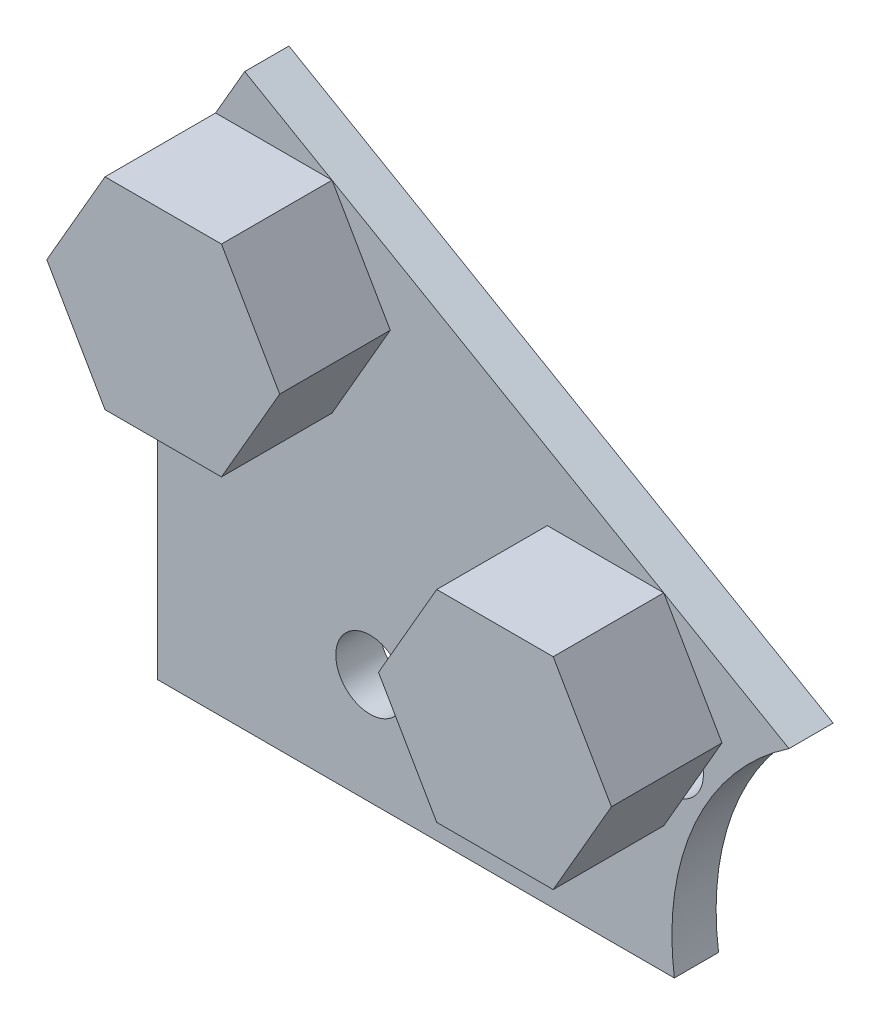
ISO-10303-21;
HEADER;
FILE_DESCRIPTION(('STEP AP214'),'2;1');
FILE_NAME('part.step','',(''),(''),'','','');
FILE_SCHEMA(('AUTOMOTIVE_DESIGN { 1 0 10303 214 1 1 1 1 }'));
ENDSEC;
DATA;
#1=APPLICATION_CONTEXT('core data for automotive mechanical design processes');
#2=APPLICATION_PROTOCOL_DEFINITION('international standard','automotive_design',2000,#1);
#3=PRODUCT_CONTEXT('',#1,'mechanical');
#4=PRODUCT('Part','Part','',(#3));
#5=PRODUCT_RELATED_PRODUCT_CATEGORY('part','',(#4));
#6=PRODUCT_DEFINITION_FORMATION('','',#4);
#7=PRODUCT_DEFINITION_CONTEXT('part definition',#1,'design');
#8=PRODUCT_DEFINITION('design','',#6,#7);
#9=PRODUCT_DEFINITION_SHAPE('','',#8);
#10=(LENGTH_UNIT() NAMED_UNIT(*) SI_UNIT(.MILLI.,.METRE.));
#11=(NAMED_UNIT(*) PLANE_ANGLE_UNIT() SI_UNIT($,.RADIAN.));
#12=(NAMED_UNIT(*) SI_UNIT($,.STERADIAN.) SOLID_ANGLE_UNIT());
#13=UNCERTAINTY_MEASURE_WITH_UNIT(LENGTH_MEASURE(1.E-05),#10,'distance_accuracy_value','');
#14=(GEOMETRIC_REPRESENTATION_CONTEXT(3) GLOBAL_UNCERTAINTY_ASSIGNED_CONTEXT((#13)) GLOBAL_UNIT_ASSIGNED_CONTEXT((#10,
#11,#12)) REPRESENTATION_CONTEXT('',''));
#15=CARTESIAN_POINT('',(0.,0.,0.));
#16=DIRECTION('',(0.,0.,1.));
#17=DIRECTION('',(1.,0.,0.));
#18=AXIS2_PLACEMENT_3D('',#15,#16,#17);
#19=CARTESIAN_POINT('',(0.,0.,0.));
#20=DIRECTION('',(0.,0.,-1.));
#21=DIRECTION('',(-1.,0.,0.));
#22=AXIS2_PLACEMENT_3D('',#19,#20,#21);
#23=PLANE('',#22);
#24=DIRECTION('',(-1.,0.,0.));
#25=VECTOR('',#24,1.);
#26=CARTESIAN_POINT('',(-27.3671361036775,21.8807621135332,0.));
#27=LINE('',#26,#25);
#28=CARTESIAN_POINT('',(-27.3671361036775,21.8807621135332,0.));
#29=VERTEX_POINT('',#28);
#30=CARTESIAN_POINT('',(-32.6328638963225,21.8807621135332,0.));
#31=VERTEX_POINT('',#30);
#32=EDGE_CURVE('E308',#29,#31,#27,.T.);
#33=ORIENTED_EDGE('',*,*,#32,.F.);
#34=DIRECTION('',(-0.866025403784439,0.5,0.));
#35=VECTOR('',#34,1.);
#36=CARTESIAN_POINT('',(-31.3164319481613,24.1608891324554,0.));
#37=LINE('',#36,#35);
#38=CARTESIAN_POINT('',(-31.3164319481613,24.1608891324554,0.));
#39=VERTEX_POINT('',#38);
#40=EDGE_CURVE('E197',#29,#39,#37,.T.);
#41=ORIENTED_EDGE('',*,*,#40,.T.);
#42=DIRECTION('',(-0.5,-0.866025403784439,0.));
#43=VECTOR('',#42,1.);
#44=CARTESIAN_POINT('',(-31.3164319481613,24.1608891324554,0.));
#45=LINE('',#44,#43);
#46=EDGE_CURVE('E195',#39,#31,#45,.T.);
#47=ORIENTED_EDGE('',*,*,#46,.T.);
#48=EDGE_LOOP('',(#33,#41,#47));
#49=FACE_BOUND('',#48,.T.);
#50=ADVANCED_FACE('F33',(#49),#23,.F.);
#51=CARTESIAN_POINT('',(-25.6473172210291,3.37653336856471,0.));
#52=DIRECTION('',(0.,0.,1.));
#53=DIRECTION('',(1.,0.,0.));
#54=AXIS2_PLACEMENT_3D('',#51,#52,#53);
#55=CIRCLE('',#54,1.55);
#56=CARTESIAN_POINT('',(-24.0973172210291,3.37653336856471,0.));
#57=VERTEX_POINT('',#56);
#58=EDGE_CURVE('E271',#57,#57,#55,.T.);
#59=ORIENTED_EDGE('',*,*,#58,.F.);
#60=EDGE_LOOP('',(#59));
#61=FACE_BOUND('',#60,.T.);
#62=DIRECTION('',(1.,0.,0.));
#63=VECTOR('',#62,1.);
#64=CARTESIAN_POINT('',(-10.9373088966795,-1.62346663143529,0.));
#65=LINE('',#64,#63);
#66=CARTESIAN_POINT('',(-35.2657277926451,-1.62346663143529,0.));
#67=VERTEX_POINT('',#66);
#68=CARTESIAN_POINT('',(-11.8896743477951,-1.62346663143529,0.));
#69=VERTEX_POINT('',#68);
#70=EDGE_CURVE('E178',#67,#69,#65,.T.);
#71=ORIENTED_EDGE('',*,*,#70,.T.);
#72=CARTESIAN_POINT('',(0.,0.,0.));
#73=DIRECTION('',(0.,0.,1.));
#74=DIRECTION('',(1.,0.,0.));
#75=AXIS2_PLACEMENT_3D('',#72,#73,#74);
#76=CIRCLE('',#75,12.);
#77=CARTESIAN_POINT('',(-6.70544875159861,9.95173135889855,0.));
#78=VERTEX_POINT('',#77);
#79=EDGE_CURVE('E161',#78,#69,#76,.T.);
#80=ORIENTED_EDGE('',*,*,#79,.F.);
#81=CARTESIAN_POINT('',(-12.3671361036775,13.2205080756888,0.));
#82=VERTEX_POINT('',#81);
#83=EDGE_CURVE('E170',#78,#82,#37,.T.);
#84=ORIENTED_EDGE('',*,*,#83,.T.);
#85=DIRECTION('',(-0.5,0.866025403784439,0.));
#86=VECTOR('',#85,1.);
#87=CARTESIAN_POINT('',(-9.73427220735493,8.66025403784439,0.));
#88=LINE('',#87,#86);
#89=CARTESIAN_POINT('',(-9.73427220735493,8.66025403784439,0.));
#90=VERTEX_POINT('',#89);
#91=EDGE_CURVE('E225',#90,#82,#88,.T.);
#92=ORIENTED_EDGE('',*,*,#91,.F.);
#93=DIRECTION('',(0.5,0.866025403784439,0.));
#94=VECTOR('',#93,1.);
#95=CARTESIAN_POINT('',(-12.3671361036775,4.1,0.));
#96=LINE('',#95,#94);
#97=CARTESIAN_POINT('',(-10.5855348451251,7.18582389864133,0.));
#98=VERTEX_POINT('',#97);
#99=EDGE_CURVE('E203',#98,#90,#96,.T.);
#100=ORIENTED_EDGE('',*,*,#99,.F.);
#101=CARTESIAN_POINT('',(-12.1243556529821,7.,0.));
#102=DIRECTION('',(0.,0.,1.));
#103=DIRECTION('',(1.,0.,0.));
#104=AXIS2_PLACEMENT_3D('',#101,#102,#103);
#105=CIRCLE('',#104,1.55);
#106=CARTESIAN_POINT('',(-11.5158734659073,5.57443013920306,0.));
#107=VERTEX_POINT('',#106);
#108=EDGE_CURVE('E265',#107,#98,#105,.T.);
#109=ORIENTED_EDGE('',*,*,#108,.F.);
#110=CARTESIAN_POINT('',(-12.3671361036775,4.1,0.));
#111=VERTEX_POINT('',#110);
#112=EDGE_CURVE('E223',#111,#107,#96,.T.);
#113=ORIENTED_EDGE('',*,*,#112,.F.);
#114=DIRECTION('',(1.,0.,0.));
#115=VECTOR('',#114,1.);
#116=CARTESIAN_POINT('',(-17.6328638963225,4.1,0.));
#117=LINE('',#116,#115);
#118=CARTESIAN_POINT('',(-17.6328638963225,4.1,0.));
#119=VERTEX_POINT('',#118);
#120=EDGE_CURVE('E212',#119,#111,#117,.T.);
#121=ORIENTED_EDGE('',*,*,#120,.F.);
#122=DIRECTION('',(0.5,-0.866025403784439,0.));
#123=VECTOR('',#122,1.);
#124=CARTESIAN_POINT('',(-20.2657277926451,8.66025403784439,0.));
#125=LINE('',#124,#123);
#126=CARTESIAN_POINT('',(-20.2657277926451,8.66025403784439,0.));
#127=VERTEX_POINT('',#126);
#128=EDGE_CURVE('E233',#127,#119,#125,.T.);
#129=ORIENTED_EDGE('',*,*,#128,.F.);
#130=DIRECTION('',(-0.5,-0.866025403784439,0.));
#131=VECTOR('',#130,1.);
#132=CARTESIAN_POINT('',(-17.6328638963225,13.2205080756888,0.));
#133=LINE('',#132,#131);
#134=CARTESIAN_POINT('',(-17.6328638963225,13.2205080756888,0.));
#135=VERTEX_POINT('',#134);
#136=EDGE_CURVE('E231',#135,#127,#133,.T.);
#137=ORIENTED_EDGE('',*,*,#136,.F.);
#138=DIRECTION('',(-1.,0.,0.));
#139=VECTOR('',#138,1.);
#140=CARTESIAN_POINT('',(-12.3671361036775,13.2205080756888,0.));
#141=LINE('',#140,#139);
#142=EDGE_CURVE('E229',#82,#135,#141,.T.);
#143=ORIENTED_EDGE('',*,*,#142,.F.);
#144=EDGE_CURVE('E196',#82,#29,#37,.T.);
#145=ORIENTED_EDGE('',*,*,#144,.T.);
#146=DIRECTION('',(-0.5,0.866025403784439,0.));
#147=VECTOR('',#146,1.);
#148=CARTESIAN_POINT('',(-24.7342722073549,17.3205080756888,0.));
#149=LINE('',#148,#147);
#150=CARTESIAN_POINT('',(-24.7342722073549,17.3205080756888,0.));
#151=VERTEX_POINT('',#150);
#152=EDGE_CURVE('E298',#151,#29,#149,.T.);
#153=ORIENTED_EDGE('',*,*,#152,.F.);
#154=DIRECTION('',(0.5,0.866025403784439,0.));
#155=VECTOR('',#154,1.);
#156=CARTESIAN_POINT('',(-27.3671361036775,12.7602540378444,0.));
#157=LINE('',#156,#155);
#158=CARTESIAN_POINT('',(-27.3671361036775,12.7602540378444,0.));
#159=VERTEX_POINT('',#158);
#160=EDGE_CURVE('E302',#159,#151,#157,.T.);
#161=ORIENTED_EDGE('',*,*,#160,.F.);
#162=DIRECTION('',(1.,0.,0.));
#163=VECTOR('',#162,1.);
#164=CARTESIAN_POINT('',(-32.6328638963225,12.7602540378444,0.));
#165=LINE('',#164,#163);
#166=CARTESIAN_POINT('',(-32.6328638963225,12.7602540378444,0.));
#167=VERTEX_POINT('',#166);
#168=EDGE_CURVE('E56',#167,#159,#165,.T.);
#169=ORIENTED_EDGE('',*,*,#168,.F.);
#170=DIRECTION('',(0.5,-0.866025403784439,0.));
#171=VECTOR('',#170,1.);
#172=CARTESIAN_POINT('',(-35.2657277926451,17.3205080756888,0.));
#173=LINE('',#172,#171);
#174=CARTESIAN_POINT('',(-35.2657277926451,17.3205080756888,0.));
#175=VERTEX_POINT('',#174);
#176=EDGE_CURVE('E306',#175,#167,#173,.T.);
#177=ORIENTED_EDGE('',*,*,#176,.F.);
#178=DIRECTION('',(0.,-1.,0.));
#179=VECTOR('',#178,1.);
#180=CARTESIAN_POINT('',(-35.2657277926451,17.3205080756888,0.));
#181=LINE('',#180,#179);
#182=EDGE_CURVE('E183',#175,#67,#181,.T.);
#183=ORIENTED_EDGE('',*,*,#182,.T.);
#184=EDGE_LOOP('',(#71,#80,#84,#92,#100,#109,#113,#121,#129,#137,#143,#145,#153,#161,#169,#177,#183));
#185=FACE_BOUND('',#184,.T.);
#186=ADVANCED_FACE('F255',(#61,#185),#23,.F.);
#187=CARTESIAN_POINT('',(0.,0.,0.));
#188=DIRECTION('',(0.,0.,1.));
#189=DIRECTION('',(1.,0.,0.));
#190=AXIS2_PLACEMENT_3D('',#187,#188,#189);
#191=PLANE('',#190);
#192=EDGE_CURVE('E186',#98,#107,#105,.T.);
#193=ORIENTED_EDGE('',*,*,#192,.F.);
#194=EDGE_CURVE('E226',#107,#98,#96,.T.);
#195=ORIENTED_EDGE('',*,*,#194,.F.);
#196=EDGE_LOOP('',(#193,#195));
#197=FACE_BOUND('',#196,.T.);
#198=ADVANCED_FACE('F368',(#197),#191,.F.);
#199=CARTESIAN_POINT('',(-12.3671361036775,4.1,5.));
#200=DIRECTION('',(-0.866025403784439,0.5,0.));
#201=DIRECTION('',(-0.5,-0.866025403784439,0.));
#202=AXIS2_PLACEMENT_3D('',#199,#200,#201);
#203=PLANE('',#202);
#204=ORIENTED_EDGE('',*,*,#112,.T.);
#205=ORIENTED_EDGE('',*,*,#194,.T.);
#206=ORIENTED_EDGE('',*,*,#99,.T.);
#207=DIRECTION('',(0.,0.,-1.));
#208=VECTOR('',#207,1.);
#209=CARTESIAN_POINT('',(-9.73427220735493,8.66025403784439,5.));
#210=LINE('',#209,#208);
#211=CARTESIAN_POINT('',(-9.73427220735493,8.66025403784439,5.));
#212=VERTEX_POINT('',#211);
#213=EDGE_CURVE('E11',#212,#90,#210,.T.);
#214=ORIENTED_EDGE('',*,*,#213,.F.);
#215=DIRECTION('',(0.5,0.866025403784439,0.));
#216=VECTOR('',#215,1.);
#217=CARTESIAN_POINT('',(-12.3671361036775,4.1,5.));
#218=LINE('',#217,#216);
#219=CARTESIAN_POINT('',(-12.3671361036775,4.1,5.));
#220=VERTEX_POINT('',#219);
#221=EDGE_CURVE('E208',#220,#212,#218,.T.);
#222=ORIENTED_EDGE('',*,*,#221,.F.);
#223=DIRECTION('',(0.,0.,-1.));
#224=VECTOR('',#223,1.);
#225=CARTESIAN_POINT('',(-12.3671361036775,4.1,5.));
#226=LINE('',#225,#224);
#227=EDGE_CURVE('E222',#220,#111,#226,.T.);
#228=ORIENTED_EDGE('',*,*,#227,.T.);
#229=EDGE_LOOP('',(#204,#205,#206,#214,#222,#228));
#230=FACE_BOUND('',#229,.T.);
#231=ADVANCED_FACE('F35',(#230),#203,.F.);
#232=CARTESIAN_POINT('',(-9.73427220735493,8.66025403784439,5.));
#233=DIRECTION('',(-0.866025403784439,-0.5,0.));
#234=DIRECTION('',(0.5,-0.866025403784439,0.));
#235=AXIS2_PLACEMENT_3D('',#232,#233,#234);
#236=PLANE('',#235);
#237=ORIENTED_EDGE('',*,*,#91,.T.);
#238=DIRECTION('',(0.,0.,-1.));
#239=VECTOR('',#238,1.);
#240=CARTESIAN_POINT('',(-12.3671361036775,13.2205080756888,5.));
#241=LINE('',#240,#239);
#242=CARTESIAN_POINT('',(-12.3671361036775,13.2205080756888,5.));
#243=VERTEX_POINT('',#242);
#244=EDGE_CURVE('E41',#243,#82,#241,.T.);
#245=ORIENTED_EDGE('',*,*,#244,.F.);
#246=DIRECTION('',(-0.5,0.866025403784439,0.));
#247=VECTOR('',#246,1.);
#248=CARTESIAN_POINT('',(-9.73427220735493,8.66025403784439,5.));
#249=LINE('',#248,#247);
#250=EDGE_CURVE('E211',#212,#243,#249,.T.);
#251=ORIENTED_EDGE('',*,*,#250,.F.);
#252=ORIENTED_EDGE('',*,*,#213,.T.);
#253=EDGE_LOOP('',(#237,#245,#251,#252));
#254=FACE_BOUND('',#253,.T.);
#255=ADVANCED_FACE('F401',(#254),#236,.F.);
#256=CARTESIAN_POINT('',(-12.3671361036775,13.2205080756888,5.));
#257=DIRECTION('',(0.,-1.,0.));
#258=DIRECTION('',(0.,0.,-1.));
#259=AXIS2_PLACEMENT_3D('',#256,#257,#258);
#260=PLANE('',#259);
#261=ORIENTED_EDGE('',*,*,#142,.T.);
#262=DIRECTION('',(0.,0.,-1.));
#263=VECTOR('',#262,1.);
#264=CARTESIAN_POINT('',(-17.6328638963225,13.2205080756888,5.));
#265=LINE('',#264,#263);
#266=CARTESIAN_POINT('',(-17.6328638963225,13.2205080756888,5.));
#267=VERTEX_POINT('',#266);
#268=EDGE_CURVE('E244',#267,#135,#265,.T.);
#269=ORIENTED_EDGE('',*,*,#268,.F.);
#270=DIRECTION('',(-1.,0.,0.));
#271=VECTOR('',#270,1.);
#272=CARTESIAN_POINT('',(-12.3671361036775,13.2205080756888,5.));
#273=LINE('',#272,#271);
#274=EDGE_CURVE('E214',#243,#267,#273,.T.);
#275=ORIENTED_EDGE('',*,*,#274,.F.);
#276=ORIENTED_EDGE('',*,*,#244,.T.);
#277=EDGE_LOOP('',(#261,#269,#275,#276));
#278=FACE_BOUND('',#277,.T.);
#279=ADVANCED_FACE('F251',(#278),#260,.F.);
#280=CARTESIAN_POINT('',(-17.6328638963225,13.2205080756888,5.));
#281=DIRECTION('',(0.866025403784439,-0.5,0.));
#282=DIRECTION('',(0.5,0.866025403784439,0.));
#283=AXIS2_PLACEMENT_3D('',#280,#281,#282);
#284=PLANE('',#283);
#285=ORIENTED_EDGE('',*,*,#136,.T.);
#286=DIRECTION('',(0.,0.,-1.));
#287=VECTOR('',#286,1.);
#288=CARTESIAN_POINT('',(-20.2657277926451,8.66025403784439,5.));
#289=LINE('',#288,#287);
#290=CARTESIAN_POINT('',(-20.2657277926451,8.66025403784439,5.));
#291=VERTEX_POINT('',#290);
#292=EDGE_CURVE('E241',#291,#127,#289,.T.);
#293=ORIENTED_EDGE('',*,*,#292,.F.);
#294=DIRECTION('',(-0.5,-0.866025403784439,0.));
#295=VECTOR('',#294,1.);
#296=CARTESIAN_POINT('',(-17.6328638963225,13.2205080756888,5.));
#297=LINE('',#296,#295);
#298=EDGE_CURVE('E216',#267,#291,#297,.T.);
#299=ORIENTED_EDGE('',*,*,#298,.F.);
#300=ORIENTED_EDGE('',*,*,#268,.T.);
#301=EDGE_LOOP('',(#285,#293,#299,#300));
#302=FACE_BOUND('',#301,.T.);
#303=ADVANCED_FACE('F395',(#302),#284,.F.);
#304=CARTESIAN_POINT('',(-20.2657277926451,8.66025403784439,5.));
#305=DIRECTION('',(0.866025403784439,0.5,0.));
#306=DIRECTION('',(-0.5,0.866025403784439,0.));
#307=AXIS2_PLACEMENT_3D('',#304,#305,#306);
#308=PLANE('',#307);
#309=ORIENTED_EDGE('',*,*,#128,.T.);
#310=DIRECTION('',(0.,0.,-1.));
#311=VECTOR('',#310,1.);
#312=CARTESIAN_POINT('',(-17.6328638963225,4.1,5.));
#313=LINE('',#312,#311);
#314=CARTESIAN_POINT('',(-17.6328638963225,4.1,5.));
#315=VERTEX_POINT('',#314);
#316=EDGE_CURVE('E238',#315,#119,#313,.T.);
#317=ORIENTED_EDGE('',*,*,#316,.F.);
#318=DIRECTION('',(0.5,-0.866025403784439,0.));
#319=VECTOR('',#318,1.);
#320=CARTESIAN_POINT('',(-20.2657277926451,8.66025403784439,5.));
#321=LINE('',#320,#319);
#322=EDGE_CURVE('E218',#291,#315,#321,.T.);
#323=ORIENTED_EDGE('',*,*,#322,.F.);
#324=ORIENTED_EDGE('',*,*,#292,.T.);
#325=EDGE_LOOP('',(#309,#317,#323,#324));
#326=FACE_BOUND('',#325,.T.);
#327=ADVANCED_FACE('F391',(#326),#308,.F.);
#328=CARTESIAN_POINT('',(-17.6328638963225,4.1,5.));
#329=DIRECTION('',(0.,1.,0.));
#330=DIRECTION('',(-1.,0.,0.));
#331=AXIS2_PLACEMENT_3D('',#328,#329,#330);
#332=PLANE('',#331);
#333=ORIENTED_EDGE('',*,*,#120,.T.);
#334=ORIENTED_EDGE('',*,*,#227,.F.);
#335=DIRECTION('',(1.,0.,0.));
#336=VECTOR('',#335,1.);
#337=CARTESIAN_POINT('',(-17.6328638963225,4.1,5.));
#338=LINE('',#337,#336);
#339=EDGE_CURVE('E220',#315,#220,#338,.T.);
#340=ORIENTED_EDGE('',*,*,#339,.F.);
#341=ORIENTED_EDGE('',*,*,#316,.T.);
#342=EDGE_LOOP('',(#333,#334,#340,#341));
#343=FACE_BOUND('',#342,.T.);
#344=ADVANCED_FACE('F384',(#343),#332,.F.);
#345=CARTESIAN_POINT('',(0.,0.,5.));
#346=DIRECTION('',(0.,0.,1.));
#347=DIRECTION('',(1.,0.,0.));
#348=AXIS2_PLACEMENT_3D('',#345,#346,#347);
#349=PLANE('',#348);
#350=ORIENTED_EDGE('',*,*,#221,.T.);
#351=ORIENTED_EDGE('',*,*,#250,.T.);
#352=ORIENTED_EDGE('',*,*,#274,.T.);
#353=ORIENTED_EDGE('',*,*,#298,.T.);
#354=ORIENTED_EDGE('',*,*,#322,.T.);
#355=ORIENTED_EDGE('',*,*,#339,.T.);
#356=EDGE_LOOP('',(#350,#351,#352,#353,#354,#355));
#357=FACE_BOUND('',#356,.T.);
#358=ADVANCED_FACE('F375',(#357),#349,.T.);
#359=CARTESIAN_POINT('',(-10.9373088966795,-1.62346663143529,-2.));
#360=DIRECTION('',(0.,-1.,0.));
#361=DIRECTION('',(1.,0.,0.));
#362=AXIS2_PLACEMENT_3D('',#359,#360,#361);
#363=PLANE('',#362);
#364=DIRECTION('',(0.,0.,1.));
#365=VECTOR('',#364,1.);
#366=CARTESIAN_POINT('',(-11.8896743477951,-1.62346663143529,-2.));
#367=LINE('',#366,#365);
#368=CARTESIAN_POINT('',(-11.8896743477951,-1.62346663143529,-2.));
#369=VERTEX_POINT('',#368);
#370=EDGE_CURVE('E48',#69,#369,#367,.F.);
#371=ORIENTED_EDGE('',*,*,#370,.F.);
#372=ORIENTED_EDGE('',*,*,#70,.F.);
#373=DIRECTION('',(0.,0.,1.));
#374=VECTOR('',#373,1.);
#375=CARTESIAN_POINT('',(-35.2657277926451,-1.62346663143529,-2.));
#376=LINE('',#375,#374);
#377=CARTESIAN_POINT('',(-35.2657277926451,-1.62346663143529,-2.));
#378=VERTEX_POINT('',#377);
#379=EDGE_CURVE('E201',#378,#67,#376,.T.);
#380=ORIENTED_EDGE('',*,*,#379,.F.);
#381=DIRECTION('',(1.,0.,0.));
#382=VECTOR('',#381,1.);
#383=CARTESIAN_POINT('',(-10.9373088966795,-1.62346663143529,-2.));
#384=LINE('',#383,#382);
#385=EDGE_CURVE('E191',#378,#369,#384,.T.);
#386=ORIENTED_EDGE('',*,*,#385,.T.);
#387=EDGE_LOOP('',(#371,#372,#380,#386));
#388=FACE_BOUND('',#387,.T.);
#389=ADVANCED_FACE('F325',(#388),#363,.T.);
#390=CARTESIAN_POINT('',(-35.2657277926451,17.3205080756888,-2.));
#391=DIRECTION('',(-1.,0.,0.));
#392=DIRECTION('',(0.,0.,1.));
#393=AXIS2_PLACEMENT_3D('',#390,#391,#392);
#394=PLANE('',#393);
#395=ORIENTED_EDGE('',*,*,#182,.F.);
#396=DIRECTION('',(0.,0.,1.));
#397=VECTOR('',#396,1.);
#398=CARTESIAN_POINT('',(-35.2657277926451,17.3205080756888,-2.));
#399=LINE('',#398,#397);
#400=CARTESIAN_POINT('',(-35.2657277926451,17.3205080756888,-2.));
#401=VERTEX_POINT('',#400);
#402=EDGE_CURVE('E204',#401,#175,#399,.T.);
#403=ORIENTED_EDGE('',*,*,#402,.F.);
#404=DIRECTION('',(0.,-1.,0.));
#405=VECTOR('',#404,1.);
#406=CARTESIAN_POINT('',(-35.2657277926451,17.3205080756888,-2.));
#407=LINE('',#406,#405);
#408=EDGE_CURVE('E180',#401,#378,#407,.T.);
#409=ORIENTED_EDGE('',*,*,#408,.T.);
#410=ORIENTED_EDGE('',*,*,#379,.T.);
#411=EDGE_LOOP('',(#395,#403,#409,#410));
#412=FACE_BOUND('',#411,.T.);
#413=ADVANCED_FACE('F328',(#412),#394,.T.);
#414=CARTESIAN_POINT('',(-31.3164319481613,24.1608891324554,-2.));
#415=DIRECTION('',(-0.866025403784439,0.5,0.));
#416=DIRECTION('',(-0.5,-0.866025403784439,0.));
#417=AXIS2_PLACEMENT_3D('',#414,#415,#416);
#418=PLANE('',#417);
#419=ORIENTED_EDGE('',*,*,#46,.F.);
#420=DIRECTION('',(0.,0.,1.));
#421=VECTOR('',#420,1.);
#422=CARTESIAN_POINT('',(-31.3164319481613,24.1608891324554,-2.));
#423=LINE('',#422,#421);
#424=CARTESIAN_POINT('',(-31.3164319481613,24.1608891324554,-2.));
#425=VERTEX_POINT('',#424);
#426=EDGE_CURVE('E193',#425,#39,#423,.T.);
#427=ORIENTED_EDGE('',*,*,#426,.F.);
#428=DIRECTION('',(-0.5,-0.866025403784439,0.));
#429=VECTOR('',#428,1.);
#430=CARTESIAN_POINT('',(-31.3164319481613,24.1608891324554,-2.));
#431=LINE('',#430,#429);
#432=EDGE_CURVE('E177',#425,#401,#431,.T.);
#433=ORIENTED_EDGE('',*,*,#432,.T.);
#434=ORIENTED_EDGE('',*,*,#402,.T.);
#435=DIRECTION('',(0.,0.,-1.));
#436=VECTOR('',#435,1.);
#437=CARTESIAN_POINT('',(-35.2657277926451,17.3205080756888,5.));
#438=LINE('',#437,#436);
#439=CARTESIAN_POINT('',(-35.2657277926451,17.3205080756888,5.));
#440=VERTEX_POINT('',#439);
#441=EDGE_CURVE('E282',#440,#175,#438,.T.);
#442=ORIENTED_EDGE('',*,*,#441,.F.);
#443=DIRECTION('',(-0.5,-0.866025403784438,0.));
#444=VECTOR('',#443,1.);
#445=CARTESIAN_POINT('',(-32.6328638963225,21.8807621135332,5.));
#446=LINE('',#445,#444);
#447=CARTESIAN_POINT('',(-32.6328638963225,21.8807621135332,5.));
#448=VERTEX_POINT('',#447);
#449=EDGE_CURVE('E318',#448,#440,#446,.T.);
#450=ORIENTED_EDGE('',*,*,#449,.F.);
#451=DIRECTION('',(0.,0.,-1.));
#452=VECTOR('',#451,1.);
#453=CARTESIAN_POINT('',(-32.6328638963225,21.8807621135332,5.));
#454=LINE('',#453,#452);
#455=EDGE_CURVE('E279',#448,#31,#454,.T.);
#456=ORIENTED_EDGE('',*,*,#455,.T.);
#457=EDGE_LOOP('',(#419,#427,#433,#434,#442,#450,#456));
#458=FACE_BOUND('',#457,.T.);
#459=ADVANCED_FACE('F336',(#458),#418,.T.);
#460=CARTESIAN_POINT('',(-31.3164319481613,24.1608891324554,-2.));
#461=DIRECTION('',(0.5,0.866025403784439,0.));
#462=DIRECTION('',(-0.866025403784439,0.5,0.));
#463=AXIS2_PLACEMENT_3D('',#460,#461,#462);
#464=PLANE('',#463);
#465=DIRECTION('',(0.,0.,1.));
#466=VECTOR('',#465,1.);
#467=CARTESIAN_POINT('',(-6.7054487515986,9.95173135889855,-2.));
#468=LINE('',#467,#466);
#469=CARTESIAN_POINT('',(-6.7054487515986,9.95173135889855,-2.));
#470=VERTEX_POINT('',#469);
#471=EDGE_CURVE('E155',#470,#78,#468,.T.);
#472=ORIENTED_EDGE('',*,*,#471,.F.);
#473=DIRECTION('',(-0.866025403784439,0.5,0.));
#474=VECTOR('',#473,1.);
#475=CARTESIAN_POINT('',(-12.3671361036775,13.2205080756888,-2.));
#476=LINE('',#475,#474);
#477=EDGE_CURVE('E167',#470,#425,#476,.T.);
#478=ORIENTED_EDGE('',*,*,#477,.T.);
#479=ORIENTED_EDGE('',*,*,#426,.T.);
#480=ORIENTED_EDGE('',*,*,#40,.F.);
#481=ORIENTED_EDGE('',*,*,#144,.F.);
#482=ORIENTED_EDGE('',*,*,#83,.F.);
#483=EDGE_LOOP('',(#472,#478,#479,#480,#481,#482));
#484=FACE_BOUND('',#483,.T.);
#485=ADVANCED_FACE('F165',(#484),#464,.T.);
#486=CARTESIAN_POINT('',(0.,0.,-2.));
#487=DIRECTION('',(0.,0.,-1.));
#488=DIRECTION('',(-1.,0.,0.));
#489=AXIS2_PLACEMENT_3D('',#486,#487,#488);
#490=PLANE('',#489);
#491=CARTESIAN_POINT('',(0.,0.,-2.));
#492=DIRECTION('',(0.,0.,1.));
#493=DIRECTION('',(1.,0.,0.));
#494=AXIS2_PLACEMENT_3D('',#491,#492,#493);
#495=CIRCLE('',#494,12.);
#496=EDGE_CURVE('E152',#470,#369,#495,.T.);
#497=ORIENTED_EDGE('',*,*,#496,.T.);
#498=ORIENTED_EDGE('',*,*,#385,.F.);
#499=ORIENTED_EDGE('',*,*,#408,.F.);
#500=ORIENTED_EDGE('',*,*,#432,.F.);
#501=ORIENTED_EDGE('',*,*,#477,.F.);
#502=EDGE_LOOP('',(#497,#498,#499,#500,#501));
#503=FACE_BOUND('',#502,.T.);
#504=CARTESIAN_POINT('',(-25.6473172210291,3.37653336856471,-2.));
#505=DIRECTION('',(0.,0.,1.));
#506=DIRECTION('',(1.,0.,0.));
#507=AXIS2_PLACEMENT_3D('',#504,#505,#506);
#508=CIRCLE('',#507,1.55);
#509=CARTESIAN_POINT('',(-24.0973172210291,3.37653336856471,-2.));
#510=VERTEX_POINT('',#509);
#511=EDGE_CURVE('E270',#510,#510,#508,.T.);
#512=ORIENTED_EDGE('',*,*,#511,.T.);
#513=EDGE_LOOP('',(#512));
#514=FACE_BOUND('',#513,.T.);
#515=CARTESIAN_POINT('',(-29.2707838524644,16.8994949366117,-2.));
#516=DIRECTION('',(0.,0.,1.));
#517=DIRECTION('',(1.,0.,0.));
#518=AXIS2_PLACEMENT_3D('',#515,#516,#517);
#519=CIRCLE('',#518,1.55);
#520=CARTESIAN_POINT('',(-27.7207838524644,16.8994949366117,-2.));
#521=VERTEX_POINT('',#520);
#522=EDGE_CURVE('E267',#521,#521,#519,.T.);
#523=ORIENTED_EDGE('',*,*,#522,.T.);
#524=EDGE_LOOP('',(#523));
#525=FACE_BOUND('',#524,.T.);
#526=CARTESIAN_POINT('',(-12.1243556529821,7.,-2.));
#527=DIRECTION('',(0.,0.,1.));
#528=DIRECTION('',(1.,0.,0.));
#529=AXIS2_PLACEMENT_3D('',#526,#527,#528);
#530=CIRCLE('',#529,1.55);
#531=CARTESIAN_POINT('',(-10.5743556529821,7.,-2.));
#532=VERTEX_POINT('',#531);
#533=EDGE_CURVE('E259',#532,#532,#530,.T.);
#534=ORIENTED_EDGE('',*,*,#533,.T.);
#535=EDGE_LOOP('',(#534));
#536=FACE_BOUND('',#535,.T.);
#537=ADVANCED_FACE('F173',(#503,#514,#525,#536),#490,.T.);
#538=CARTESIAN_POINT('',(-12.1243556529821,7.,-2.));
#539=DIRECTION('',(0.,0.,1.));
#540=DIRECTION('',(1.,0.,0.));
#541=AXIS2_PLACEMENT_3D('',#538,#539,#540);
#542=CYLINDRICAL_SURFACE('',#541,1.55);
#543=ORIENTED_EDGE('',*,*,#533,.F.);
#544=EDGE_LOOP('',(#543));
#545=FACE_BOUND('',#544,.T.);
#546=ORIENTED_EDGE('',*,*,#192,.T.);
#547=ORIENTED_EDGE('',*,*,#108,.T.);
#548=EDGE_LOOP('',(#546,#547));
#549=FACE_BOUND('',#548,.T.);
#550=ADVANCED_FACE('F415',(#545,#549),#542,.F.);
#551=CARTESIAN_POINT('',(-29.2707838524644,16.8994949366117,-2.));
#552=DIRECTION('',(0.,0.,1.));
#553=DIRECTION('',(1.,0.,0.));
#554=AXIS2_PLACEMENT_3D('',#551,#552,#553);
#555=CYLINDRICAL_SURFACE('',#554,1.55);
#556=ORIENTED_EDGE('',*,*,#522,.F.);
#557=EDGE_LOOP('',(#556));
#558=FACE_BOUND('',#557,.T.);
#559=CARTESIAN_POINT('',(-29.2707838524644,16.8994949366117,0.));
#560=DIRECTION('',(0.,0.,1.));
#561=DIRECTION('',(1.,0.,0.));
#562=AXIS2_PLACEMENT_3D('',#559,#560,#561);
#563=CIRCLE('',#562,1.55);
#564=CARTESIAN_POINT('',(-27.7207838524644,16.8994949366117,0.));
#565=VERTEX_POINT('',#564);
#566=EDGE_CURVE('E274',#565,#565,#563,.F.);
#567=ORIENTED_EDGE('',*,*,#566,.F.);
#568=EDGE_LOOP('',(#567));
#569=FACE_BOUND('',#568,.T.);
#570=ADVANCED_FACE('F426',(#558,#569),#555,.F.);
#571=CARTESIAN_POINT('',(-25.6473172210291,3.37653336856471,-2.));
#572=DIRECTION('',(0.,0.,1.));
#573=DIRECTION('',(1.,0.,0.));
#574=AXIS2_PLACEMENT_3D('',#571,#572,#573);
#575=CYLINDRICAL_SURFACE('',#574,1.55);
#576=ORIENTED_EDGE('',*,*,#511,.F.);
#577=EDGE_LOOP('',(#576));
#578=FACE_BOUND('',#577,.T.);
#579=ORIENTED_EDGE('',*,*,#58,.T.);
#580=EDGE_LOOP('',(#579));
#581=FACE_BOUND('',#580,.T.);
#582=ADVANCED_FACE('F432',(#578,#581),#575,.F.);
#583=CARTESIAN_POINT('',(0.,0.,0.));
#584=DIRECTION('',(0.,0.,1.));
#585=DIRECTION('',(1.,0.,0.));
#586=AXIS2_PLACEMENT_3D('',#583,#584,#585);
#587=PLANE('',#586);
#588=ORIENTED_EDGE('',*,*,#566,.T.);
#589=EDGE_LOOP('',(#588));
#590=FACE_BOUND('',#589,.T.);
#591=ADVANCED_FACE('F438',(#590),#587,.F.);
#592=CARTESIAN_POINT('',(-27.3671361036775,21.8807621135332,5.));
#593=DIRECTION('',(0.,-1.,0.));
#594=DIRECTION('',(1.,0.,0.));
#595=AXIS2_PLACEMENT_3D('',#592,#593,#594);
#596=PLANE('',#595);
#597=ORIENTED_EDGE('',*,*,#32,.T.);
#598=ORIENTED_EDGE('',*,*,#455,.F.);
#599=DIRECTION('',(-1.,0.,0.));
#600=VECTOR('',#599,1.);
#601=CARTESIAN_POINT('',(-27.3671361036775,21.8807621135332,5.));
#602=LINE('',#601,#600);
#603=CARTESIAN_POINT('',(-27.3671361036775,21.8807621135332,5.));
#604=VERTEX_POINT('',#603);
#605=EDGE_CURVE('E301',#604,#448,#602,.T.);
#606=ORIENTED_EDGE('',*,*,#605,.F.);
#607=DIRECTION('',(0.,0.,-1.));
#608=VECTOR('',#607,1.);
#609=CARTESIAN_POINT('',(-27.3671361036775,21.8807621135332,5.));
#610=LINE('',#609,#608);
#611=EDGE_CURVE('E294',#604,#29,#610,.T.);
#612=ORIENTED_EDGE('',*,*,#611,.T.);
#613=EDGE_LOOP('',(#597,#598,#606,#612));
#614=FACE_BOUND('',#613,.T.);
#615=ADVANCED_FACE('F345',(#614),#596,.F.);
#616=CARTESIAN_POINT('',(-35.2657277926451,17.3205080756888,5.));
#617=DIRECTION('',(0.866025403784439,0.5,0.));
#618=DIRECTION('',(-0.5,0.866025403784439,0.));
#619=AXIS2_PLACEMENT_3D('',#616,#617,#618);
#620=PLANE('',#619);
#621=ORIENTED_EDGE('',*,*,#176,.T.);
#622=DIRECTION('',(0.,0.,-1.));
#623=VECTOR('',#622,1.);
#624=CARTESIAN_POINT('',(-32.6328638963225,12.7602540378444,5.));
#625=LINE('',#624,#623);
#626=CARTESIAN_POINT('',(-32.6328638963225,12.7602540378444,5.));
#627=VERTEX_POINT('',#626);
#628=EDGE_CURVE('E285',#627,#167,#625,.T.);
#629=ORIENTED_EDGE('',*,*,#628,.F.);
#630=DIRECTION('',(0.5,-0.866025403784439,0.));
#631=VECTOR('',#630,1.);
#632=CARTESIAN_POINT('',(-35.2657277926451,17.3205080756888,5.));
#633=LINE('',#632,#631);
#634=EDGE_CURVE('E316',#440,#627,#633,.T.);
#635=ORIENTED_EDGE('',*,*,#634,.F.);
#636=ORIENTED_EDGE('',*,*,#441,.T.);
#637=EDGE_LOOP('',(#621,#629,#635,#636));
#638=FACE_BOUND('',#637,.T.);
#639=ADVANCED_FACE('F332',(#638),#620,.F.);
#640=CARTESIAN_POINT('',(-32.6328638963225,12.7602540378444,5.));
#641=DIRECTION('',(0.,1.,0.));
#642=DIRECTION('',(0.,0.,1.));
#643=AXIS2_PLACEMENT_3D('',#640,#641,#642);
#644=PLANE('',#643);
#645=ORIENTED_EDGE('',*,*,#168,.T.);
#646=DIRECTION('',(0.,0.,-1.));
#647=VECTOR('',#646,1.);
#648=CARTESIAN_POINT('',(-27.3671361036775,12.7602540378444,5.));
#649=LINE('',#648,#647);
#650=CARTESIAN_POINT('',(-27.3671361036775,12.7602540378444,5.));
#651=VERTEX_POINT('',#650);
#652=EDGE_CURVE('E288',#651,#159,#649,.T.);
#653=ORIENTED_EDGE('',*,*,#652,.F.);
#654=DIRECTION('',(1.,0.,0.));
#655=VECTOR('',#654,1.);
#656=CARTESIAN_POINT('',(-32.6328638963225,12.7602540378444,5.));
#657=LINE('',#656,#655);
#658=EDGE_CURVE('E314',#627,#651,#657,.T.);
#659=ORIENTED_EDGE('',*,*,#658,.F.);
#660=ORIENTED_EDGE('',*,*,#628,.T.);
#661=EDGE_LOOP('',(#645,#653,#659,#660));
#662=FACE_BOUND('',#661,.T.);
#663=ADVANCED_FACE('F354',(#662),#644,.F.);
#664=CARTESIAN_POINT('',(-27.3671361036775,12.7602540378444,5.));
#665=DIRECTION('',(-0.866025403784438,0.5,0.));
#666=DIRECTION('',(-0.5,-0.866025403784438,0.));
#667=AXIS2_PLACEMENT_3D('',#664,#665,#666);
#668=PLANE('',#667);
#669=ORIENTED_EDGE('',*,*,#160,.T.);
#670=DIRECTION('',(0.,0.,-1.));
#671=VECTOR('',#670,1.);
#672=CARTESIAN_POINT('',(-24.7342722073549,17.3205080756888,5.));
#673=LINE('',#672,#671);
#674=CARTESIAN_POINT('',(-24.7342722073549,17.3205080756888,5.));
#675=VERTEX_POINT('',#674);
#676=EDGE_CURVE('E291',#675,#151,#673,.T.);
#677=ORIENTED_EDGE('',*,*,#676,.F.);
#678=DIRECTION('',(0.5,0.866025403784439,0.));
#679=VECTOR('',#678,1.);
#680=CARTESIAN_POINT('',(-27.3671361036775,12.7602540378444,5.));
#681=LINE('',#680,#679);
#682=EDGE_CURVE('E312',#651,#675,#681,.T.);
#683=ORIENTED_EDGE('',*,*,#682,.F.);
#684=ORIENTED_EDGE('',*,*,#652,.T.);
#685=EDGE_LOOP('',(#669,#677,#683,#684));
#686=FACE_BOUND('',#685,.T.);
#687=ADVANCED_FACE('F352',(#686),#668,.F.);
#688=CARTESIAN_POINT('',(-24.7342722073549,17.3205080756888,5.));
#689=DIRECTION('',(-0.866025403784439,-0.5,0.));
#690=DIRECTION('',(0.5,-0.866025403784439,0.));
#691=AXIS2_PLACEMENT_3D('',#688,#689,#690);
#692=PLANE('',#691);
#693=ORIENTED_EDGE('',*,*,#152,.T.);
#694=ORIENTED_EDGE('',*,*,#611,.F.);
#695=DIRECTION('',(-0.5,0.866025403784439,0.));
#696=VECTOR('',#695,1.);
#697=CARTESIAN_POINT('',(-24.7342722073549,17.3205080756888,5.));
#698=LINE('',#697,#696);
#699=EDGE_CURVE('E297',#675,#604,#698,.T.);
#700=ORIENTED_EDGE('',*,*,#699,.F.);
#701=ORIENTED_EDGE('',*,*,#676,.T.);
#702=EDGE_LOOP('',(#693,#694,#700,#701));
#703=FACE_BOUND('',#702,.T.);
#704=ADVANCED_FACE('F341',(#703),#692,.F.);
#705=CARTESIAN_POINT('',(0.,0.,5.));
#706=DIRECTION('',(0.,0.,1.));
#707=DIRECTION('',(1.,0.,0.));
#708=AXIS2_PLACEMENT_3D('',#705,#706,#707);
#709=PLANE('',#708);
#710=ORIENTED_EDGE('',*,*,#605,.T.);
#711=ORIENTED_EDGE('',*,*,#449,.T.);
#712=ORIENTED_EDGE('',*,*,#634,.T.);
#713=ORIENTED_EDGE('',*,*,#658,.T.);
#714=ORIENTED_EDGE('',*,*,#682,.T.);
#715=ORIENTED_EDGE('',*,*,#699,.T.);
#716=EDGE_LOOP('',(#710,#711,#712,#713,#714,#715));
#717=FACE_BOUND('',#716,.T.);
#718=ADVANCED_FACE('F347',(#717),#709,.T.);
#719=CARTESIAN_POINT('',(0.,0.,-2.));
#720=DIRECTION('',(0.,0.,1.));
#721=DIRECTION('',(1.,0.,0.));
#722=AXIS2_PLACEMENT_3D('',#719,#720,#721);
#723=CYLINDRICAL_SURFACE('',#722,12.);
#724=ORIENTED_EDGE('',*,*,#370,.T.);
#725=ORIENTED_EDGE('',*,*,#496,.F.);
#726=ORIENTED_EDGE('',*,*,#471,.T.);
#727=ORIENTED_EDGE('',*,*,#79,.T.);
#728=EDGE_LOOP('',(#724,#725,#726,#727));
#729=FACE_BOUND('',#728,.T.);
#730=ADVANCED_FACE('F154',(#729),#723,.F.);
#731=CLOSED_SHELL('',(#50,#186,#198,#231,#255,#279,#303,#327,#344,#358,#389,#413,#459,#485,#537,
#550,#570,#582,#591,#615,#639,#663,#687,#704,#718,#730));
#732=MANIFOLD_SOLID_BREP('B2',#731);
#733=ADVANCED_BREP_SHAPE_REPRESENTATION('',(#18,#732),#14);
#734=SHAPE_DEFINITION_REPRESENTATION(#9,#733);
ENDSEC;
END-ISO-10303-21;
